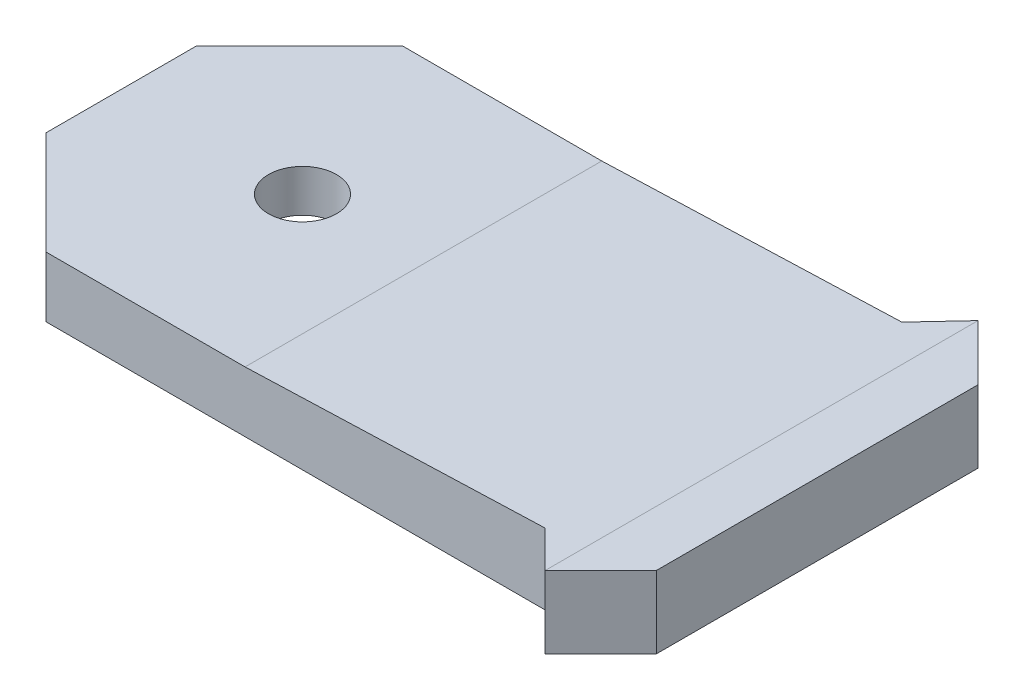
ISO-10303-21;
HEADER;
FILE_DESCRIPTION(('STEP AP214'),'2;1');
FILE_NAME('part.step','',(''),(''),'','','');
FILE_SCHEMA(('AUTOMOTIVE_DESIGN { 1 0 10303 214 1 1 1 1 }'));
ENDSEC;
DATA;
#1=APPLICATION_CONTEXT('core data for automotive mechanical design processes');
#2=APPLICATION_PROTOCOL_DEFINITION('international standard','automotive_design',2000,#1);
#3=PRODUCT_CONTEXT('',#1,'mechanical');
#4=PRODUCT('Part','Part','',(#3));
#5=PRODUCT_RELATED_PRODUCT_CATEGORY('part','',(#4));
#6=PRODUCT_DEFINITION_FORMATION('','',#4);
#7=PRODUCT_DEFINITION_CONTEXT('part definition',#1,'design');
#8=PRODUCT_DEFINITION('design','',#6,#7);
#9=PRODUCT_DEFINITION_SHAPE('','',#8);
#10=(LENGTH_UNIT() NAMED_UNIT(*) SI_UNIT(.MILLI.,.METRE.));
#11=(NAMED_UNIT(*) PLANE_ANGLE_UNIT() SI_UNIT($,.RADIAN.));
#12=(NAMED_UNIT(*) SI_UNIT($,.STERADIAN.) SOLID_ANGLE_UNIT());
#13=UNCERTAINTY_MEASURE_WITH_UNIT(LENGTH_MEASURE(1.E-05),#10,'distance_accuracy_value','');
#14=(GEOMETRIC_REPRESENTATION_CONTEXT(3) GLOBAL_UNCERTAINTY_ASSIGNED_CONTEXT((#13)) GLOBAL_UNIT_ASSIGNED_CONTEXT((#10,
#11,#12)) REPRESENTATION_CONTEXT('',''));
#15=CARTESIAN_POINT('',(0.,0.,0.));
#16=DIRECTION('',(0.,0.,1.));
#17=DIRECTION('',(1.,0.,0.));
#18=AXIS2_PLACEMENT_3D('',#15,#16,#17);
#19=CARTESIAN_POINT('',(12.,6.,0.));
#20=DIRECTION('',(0.,-1.,0.));
#21=DIRECTION('',(0.,0.,-1.));
#22=AXIS2_PLACEMENT_3D('',#19,#20,#21);
#23=CYLINDRICAL_SURFACE('',#22,2.25);
#24=CARTESIAN_POINT('',(12.,4.,0.));
#25=DIRECTION('',(0.,-1.,0.));
#26=DIRECTION('',(0.,0.,-1.));
#27=AXIS2_PLACEMENT_3D('',#24,#25,#26);
#28=CIRCLE('',#27,2.25);
#29=CARTESIAN_POINT('',(12.,4.,-2.25));
#30=VERTEX_POINT('',#29);
#31=EDGE_CURVE('E146',#30,#30,#28,.T.);
#32=ORIENTED_EDGE('',*,*,#31,.F.);
#33=EDGE_LOOP('',(#32));
#34=FACE_BOUND('',#33,.T.);
#35=CARTESIAN_POINT('',(12.,1.2,0.));
#36=DIRECTION('',(0.,-1.,0.));
#37=DIRECTION('',(0.,0.,-1.));
#38=AXIS2_PLACEMENT_3D('',#35,#36,#37);
#39=CIRCLE('',#38,2.25);
#40=CARTESIAN_POINT('',(12.,1.2,-2.25));
#41=VERTEX_POINT('',#40);
#42=EDGE_CURVE('E171',#41,#41,#39,.T.);
#43=ORIENTED_EDGE('',*,*,#42,.T.);
#44=EDGE_LOOP('',(#43));
#45=FACE_BOUND('',#44,.T.);
#46=ADVANCED_FACE('F37',(#34,#45),#23,.F.);
#47=CARTESIAN_POINT('',(0.,0.,0.));
#48=DIRECTION('',(0.,1.,0.));
#49=DIRECTION('',(0.,0.,1.));
#50=AXIS2_PLACEMENT_3D('',#47,#48,#49);
#51=PLANE('',#50);
#52=CARTESIAN_POINT('',(12.,0.,0.));
#53=DIRECTION('',(0.,-1.,0.));
#54=DIRECTION('',(0.,0.,-1.));
#55=AXIS2_PLACEMENT_3D('',#52,#53,#54);
#56=CIRCLE('',#55,10.);
#57=CARTESIAN_POINT('',(12.,0.,-10.));
#58=VERTEX_POINT('',#57);
#59=EDGE_CURVE('E192',#58,#58,#56,.T.);
#60=ORIENTED_EDGE('',*,*,#59,.F.);
#61=EDGE_LOOP('',(#60));
#62=FACE_BOUND('',#61,.T.);
#63=DIRECTION('',(-0.707106781186548,0.,0.707106781186547));
#64=VECTOR('',#63,1.);
#65=CARTESIAN_POINT('',(0.,0.,-4.97056274847714));
#66=LINE('',#65,#64);
#67=CARTESIAN_POINT('',(6.82943725152287,0.,-11.8));
#68=VERTEX_POINT('',#67);
#69=CARTESIAN_POINT('',(0.,0.,-4.97056274847714));
#70=VERTEX_POINT('',#69);
#71=EDGE_CURVE('E174',#68,#70,#66,.T.);
#72=ORIENTED_EDGE('',*,*,#71,.F.);
#73=DIRECTION('',(-1.,0.,0.));
#74=VECTOR('',#73,1.);
#75=CARTESIAN_POINT('',(6.82943725152287,0.,-11.8));
#76=LINE('',#75,#74);
#77=CARTESIAN_POINT('',(39.85294373,0.,-11.8));
#78=VERTEX_POINT('',#77);
#79=EDGE_CURVE('E221',#78,#68,#76,.T.);
#80=ORIENTED_EDGE('',*,*,#79,.F.);
#81=DIRECTION('',(-0.707106781186425,0.,0.70710678118667));
#82=VECTOR('',#81,1.);
#83=CARTESIAN_POINT('',(39.85294373,0.,-11.8));
#84=LINE('',#83,#82);
#85=CARTESIAN_POINT('',(42.3718560479508,0.,-14.3189123179507));
#86=VERTEX_POINT('',#85);
#87=EDGE_CURVE('E219',#86,#78,#84,.T.);
#88=ORIENTED_EDGE('',*,*,#87,.F.);
#89=DIRECTION('',(-0.707106781186547,0.,-0.707106781186548));
#90=VECTOR('',#89,1.);
#91=CARTESIAN_POINT('',(46.0488113101208,0.,-10.6419570557807));
#92=LINE('',#91,#90);
#93=CARTESIAN_POINT('',(46.0488113101208,0.,-10.6419570557807));
#94=VERTEX_POINT('',#93);
#95=EDGE_CURVE('E151',#94,#86,#92,.T.);
#96=ORIENTED_EDGE('',*,*,#95,.F.);
#97=DIRECTION('',(0.,0.,-1.));
#98=VECTOR('',#97,1.);
#99=CARTESIAN_POINT('',(46.0488113101208,0.,10.6419570557807));
#100=LINE('',#99,#98);
#101=CARTESIAN_POINT('',(46.0488113101208,0.,10.6419570557807));
#102=VERTEX_POINT('',#101);
#103=EDGE_CURVE('E215',#102,#94,#100,.T.);
#104=ORIENTED_EDGE('',*,*,#103,.F.);
#105=DIRECTION('',(0.707106781186549,0.,-0.707106781186546));
#106=VECTOR('',#105,1.);
#107=CARTESIAN_POINT('',(42.3718560479508,0.,14.3189123179508));
#108=LINE('',#107,#106);
#109=CARTESIAN_POINT('',(42.3718560479508,0.,14.3189123179508));
#110=VERTEX_POINT('',#109);
#111=EDGE_CURVE('E212',#110,#102,#108,.T.);
#112=ORIENTED_EDGE('',*,*,#111,.F.);
#113=DIRECTION('',(0.707106781186546,0.,0.707106781186549));
#114=VECTOR('',#113,1.);
#115=CARTESIAN_POINT('',(40.05294373,0.,12.));
#116=LINE('',#115,#114);
#117=CARTESIAN_POINT('',(39.85294373,0.,11.8));
#118=VERTEX_POINT('',#117);
#119=EDGE_CURVE('E209',#118,#110,#116,.T.);
#120=ORIENTED_EDGE('',*,*,#119,.F.);
#121=DIRECTION('',(1.,0.,0.));
#122=VECTOR('',#121,1.);
#123=CARTESIAN_POINT('',(6.82943725152288,0.,11.8));
#124=LINE('',#123,#122);
#125=CARTESIAN_POINT('',(6.82943725152288,0.,11.8));
#126=VERTEX_POINT('',#125);
#127=EDGE_CURVE('E207',#126,#118,#124,.T.);
#128=ORIENTED_EDGE('',*,*,#127,.F.);
#129=DIRECTION('',(0.707106781186549,0.,0.707106781186546));
#130=VECTOR('',#129,1.);
#131=CARTESIAN_POINT('',(0.,0.,4.97056274847714));
#132=LINE('',#131,#130);
#133=CARTESIAN_POINT('',(0.,0.,4.97056274847714));
#134=VERTEX_POINT('',#133);
#135=EDGE_CURVE('E204',#134,#126,#132,.T.);
#136=ORIENTED_EDGE('',*,*,#135,.F.);
#137=DIRECTION('',(0.,0.,1.));
#138=VECTOR('',#137,1.);
#139=CARTESIAN_POINT('',(0.,0.,-4.97056274847714));
#140=LINE('',#139,#138);
#141=EDGE_CURVE('E201',#70,#134,#140,.T.);
#142=ORIENTED_EDGE('',*,*,#141,.F.);
#143=EDGE_LOOP('',(#72,#80,#88,#96,#104,#112,#120,#128,#136,#142));
#144=FACE_BOUND('',#143,.T.);
#145=ADVANCED_FACE('F226',(#62,#144),#51,.F.);
#146=CARTESIAN_POINT('',(0.,6.,-4.97056274847714));
#147=DIRECTION('',(0.707106781186547,0.,0.707106781186548));
#148=DIRECTION('',(0.707106781186548,0.,-0.707106781186547));
#149=AXIS2_PLACEMENT_3D('',#146,#147,#148);
#150=PLANE('',#149);
#151=DIRECTION('',(0.,-1.,0.));
#152=VECTOR('',#151,1.);
#153=CARTESIAN_POINT('',(0.,6.,-4.97056274847714));
#154=LINE('',#153,#152);
#155=CARTESIAN_POINT('',(0.,4.,-4.97056274847714));
#156=VERTEX_POINT('',#155);
#157=EDGE_CURVE('E168',#156,#70,#154,.T.);
#158=ORIENTED_EDGE('',*,*,#157,.F.);
#159=DIRECTION('',(0.707106781186548,0.,-0.707106781186547));
#160=VECTOR('',#159,1.);
#161=CARTESIAN_POINT('',(0.,4.,-4.97056274847714));
#162=LINE('',#161,#160);
#163=CARTESIAN_POINT('',(6.82943725152287,4.,-11.8));
#164=VERTEX_POINT('',#163);
#165=EDGE_CURVE('E137',#156,#164,#162,.T.);
#166=ORIENTED_EDGE('',*,*,#165,.T.);
#167=DIRECTION('',(0.,-1.,0.));
#168=VECTOR('',#167,1.);
#169=CARTESIAN_POINT('',(6.82943725152287,6.,-11.8));
#170=LINE('',#169,#168);
#171=EDGE_CURVE('E60',#164,#68,#170,.T.);
#172=ORIENTED_EDGE('',*,*,#171,.T.);
#173=ORIENTED_EDGE('',*,*,#71,.T.);
#174=EDGE_LOOP('',(#158,#166,#172,#173));
#175=FACE_BOUND('',#174,.T.);
#176=ADVANCED_FACE('F39',(#175),#150,.F.);
#177=CARTESIAN_POINT('',(0.,6.,-4.97056274847714));
#178=DIRECTION('',(1.,0.,0.));
#179=DIRECTION('',(0.,0.,-1.));
#180=AXIS2_PLACEMENT_3D('',#177,#178,#179);
#181=PLANE('',#180);
#182=DIRECTION('',(0.,-1.,0.));
#183=VECTOR('',#182,1.);
#184=CARTESIAN_POINT('',(0.,6.,4.97056274847714));
#185=LINE('',#184,#183);
#186=CARTESIAN_POINT('',(0.,4.,4.97056274847715));
#187=VERTEX_POINT('',#186);
#188=EDGE_CURVE('E166',#187,#134,#185,.T.);
#189=ORIENTED_EDGE('',*,*,#188,.F.);
#190=DIRECTION('',(0.,0.,-1.));
#191=VECTOR('',#190,1.);
#192=CARTESIAN_POINT('',(0.,4.,14.3189123179508));
#193=LINE('',#192,#191);
#194=EDGE_CURVE('E181',#187,#156,#193,.T.);
#195=ORIENTED_EDGE('',*,*,#194,.T.);
#196=ORIENTED_EDGE('',*,*,#157,.T.);
#197=ORIENTED_EDGE('',*,*,#141,.T.);
#198=EDGE_LOOP('',(#189,#195,#196,#197));
#199=FACE_BOUND('',#198,.T.);
#200=ADVANCED_FACE('F232',(#199),#181,.F.);
#201=CARTESIAN_POINT('',(0.,6.,4.97056274847714));
#202=DIRECTION('',(0.707106781186546,0.,-0.707106781186549));
#203=DIRECTION('',(-0.707106781186549,0.,-0.707106781186546));
#204=AXIS2_PLACEMENT_3D('',#201,#202,#203);
#205=PLANE('',#204);
#206=DIRECTION('',(0.,-1.,0.));
#207=VECTOR('',#206,1.);
#208=CARTESIAN_POINT('',(6.82943725152288,6.,11.8));
#209=LINE('',#208,#207);
#210=CARTESIAN_POINT('',(6.82943725152288,4.,11.8));
#211=VERTEX_POINT('',#210);
#212=EDGE_CURVE('E164',#211,#126,#209,.T.);
#213=ORIENTED_EDGE('',*,*,#212,.F.);
#214=DIRECTION('',(-0.707106781186549,0.,-0.707106781186546));
#215=VECTOR('',#214,1.);
#216=CARTESIAN_POINT('',(0.,4.,4.97056274847714));
#217=LINE('',#216,#215);
#218=EDGE_CURVE('E239',#211,#187,#217,.T.);
#219=ORIENTED_EDGE('',*,*,#218,.T.);
#220=ORIENTED_EDGE('',*,*,#188,.T.);
#221=ORIENTED_EDGE('',*,*,#135,.T.);
#222=EDGE_LOOP('',(#213,#219,#220,#221));
#223=FACE_BOUND('',#222,.T.);
#224=ADVANCED_FACE('F289',(#223),#205,.F.);
#225=CARTESIAN_POINT('',(6.82943725152288,6.,11.8));
#226=DIRECTION('',(0.,0.,-1.));
#227=DIRECTION('',(-1.,0.,0.));
#228=AXIS2_PLACEMENT_3D('',#225,#226,#227);
#229=PLANE('',#228);
#230=DIRECTION('',(0.,-1.,0.));
#231=VECTOR('',#230,1.);
#232=CARTESIAN_POINT('',(39.85294373,6.,11.8));
#233=LINE('',#232,#231);
#234=CARTESIAN_POINT('',(39.85294373,4.69328007172783,11.8));
#235=VERTEX_POINT('',#234);
#236=EDGE_CURVE('E162',#235,#118,#233,.T.);
#237=ORIENTED_EDGE('',*,*,#236,.F.);
#238=DIRECTION('',(-0.999390827019096,-0.0348994967024938,0.));
#239=VECTOR('',#238,1.);
#240=CARTESIAN_POINT('',(6.91523513971955,3.54306994246052,11.8));
#241=LINE('',#240,#239);
#242=CARTESIAN_POINT('',(20.,4.,11.8));
#243=VERTEX_POINT('',#242);
#244=EDGE_CURVE('E180',#235,#243,#241,.T.);
#245=ORIENTED_EDGE('',*,*,#244,.T.);
#246=DIRECTION('',(-1.,0.,0.));
#247=VECTOR('',#246,1.);
#248=CARTESIAN_POINT('',(6.82943725152288,4.,11.8));
#249=LINE('',#248,#247);
#250=EDGE_CURVE('E187',#243,#211,#249,.T.);
#251=ORIENTED_EDGE('',*,*,#250,.T.);
#252=ORIENTED_EDGE('',*,*,#212,.T.);
#253=ORIENTED_EDGE('',*,*,#127,.T.);
#254=EDGE_LOOP('',(#237,#245,#251,#252,#253));
#255=FACE_BOUND('',#254,.T.);
#256=ADVANCED_FACE('F186',(#255),#229,.F.);
#257=CARTESIAN_POINT('',(40.05294373,6.,12.));
#258=DIRECTION('',(0.707106781186549,0.,-0.707106781186546));
#259=DIRECTION('',(-0.707106781186546,0.,-0.707106781186549));
#260=AXIS2_PLACEMENT_3D('',#257,#258,#259);
#261=PLANE('',#260);
#262=DIRECTION('',(0.,-1.,0.));
#263=VECTOR('',#262,1.);
#264=CARTESIAN_POINT('',(42.3718560479508,6.,14.3189123179508));
#265=LINE('',#264,#263);
#266=CARTESIAN_POINT('',(42.3718560479508,4.78124242815289,14.3189123179508));
#267=VERTEX_POINT('',#266);
#268=EDGE_CURVE('E160',#267,#110,#265,.T.);
#269=ORIENTED_EDGE('',*,*,#268,.F.);
#270=DIRECTION('',(-0.706891307583162,-0.0246851884078267,-0.706891307583166));
#271=VECTOR('',#270,1.);
#272=CARTESIAN_POINT('',(40.0756237879752,4.70105623070278,12.0226800579752));
#273=LINE('',#272,#271);
#274=EDGE_CURVE('E136',#267,#235,#273,.T.);
#275=ORIENTED_EDGE('',*,*,#274,.T.);
#276=ORIENTED_EDGE('',*,*,#236,.T.);
#277=ORIENTED_EDGE('',*,*,#119,.T.);
#278=EDGE_LOOP('',(#269,#275,#276,#277));
#279=FACE_BOUND('',#278,.T.);
#280=ADVANCED_FACE('F282',(#279),#261,.F.);
#281=CARTESIAN_POINT('',(42.3718560479508,6.,14.3189123179508));
#282=DIRECTION('',(-0.707106781186546,0.,-0.707106781186549));
#283=DIRECTION('',(-0.707106781186549,0.,0.707106781186546));
#284=AXIS2_PLACEMENT_3D('',#281,#282,#283);
#285=PLANE('',#284);
#286=DIRECTION('',(0.,-1.,0.));
#287=VECTOR('',#286,1.);
#288=CARTESIAN_POINT('',(46.0488113101208,6.,10.6419570557807));
#289=LINE('',#288,#287);
#290=CARTESIAN_POINT('',(46.0488113101208,4.78124242815289,10.6419570557807));
#291=VERTEX_POINT('',#290);
#292=EDGE_CURVE('E154',#291,#102,#289,.T.);
#293=ORIENTED_EDGE('',*,*,#292,.F.);
#294=DIRECTION('',(-0.707106781186549,0.,0.707106781186546));
#295=VECTOR('',#294,1.);
#296=CARTESIAN_POINT('',(42.3718560479508,4.78124242815289,14.3189123179508));
#297=LINE('',#296,#295);
#298=EDGE_CURVE('E190',#291,#267,#297,.T.);
#299=ORIENTED_EDGE('',*,*,#298,.T.);
#300=ORIENTED_EDGE('',*,*,#268,.T.);
#301=ORIENTED_EDGE('',*,*,#111,.T.);
#302=EDGE_LOOP('',(#293,#299,#300,#301));
#303=FACE_BOUND('',#302,.T.);
#304=ADVANCED_FACE('F278',(#303),#285,.F.);
#305=CARTESIAN_POINT('',(46.0488113101208,6.,10.6419570557807));
#306=DIRECTION('',(-1.,0.,0.));
#307=DIRECTION('',(0.,0.,1.));
#308=AXIS2_PLACEMENT_3D('',#305,#306,#307);
#309=PLANE('',#308);
#310=DIRECTION('',(0.,-1.,0.));
#311=VECTOR('',#310,1.);
#312=CARTESIAN_POINT('',(46.0488113101208,6.,-10.6419570557807));
#313=LINE('',#312,#311);
#314=CARTESIAN_POINT('',(46.0488113101208,4.78124242815289,-10.6419570557807));
#315=VERTEX_POINT('',#314);
#316=EDGE_CURVE('E152',#315,#94,#313,.T.);
#317=ORIENTED_EDGE('',*,*,#316,.F.);
#318=DIRECTION('',(0.,0.,-1.));
#319=VECTOR('',#318,1.);
#320=CARTESIAN_POINT('',(46.0488113101208,4.78124242815289,14.3189123179508));
#321=LINE('',#320,#319);
#322=EDGE_CURVE('E126',#291,#315,#321,.T.);
#323=ORIENTED_EDGE('',*,*,#322,.F.);
#324=ORIENTED_EDGE('',*,*,#292,.T.);
#325=ORIENTED_EDGE('',*,*,#103,.T.);
#326=EDGE_LOOP('',(#317,#323,#324,#325));
#327=FACE_BOUND('',#326,.T.);
#328=ADVANCED_FACE('F275',(#327),#309,.F.);
#329=CARTESIAN_POINT('',(46.0488113101208,6.,-10.6419570557807));
#330=DIRECTION('',(-0.707106781186548,0.,0.707106781186547));
#331=DIRECTION('',(0.707106781186547,0.,0.707106781186548));
#332=AXIS2_PLACEMENT_3D('',#329,#330,#331);
#333=PLANE('',#332);
#334=DIRECTION('',(0.,-1.,0.));
#335=VECTOR('',#334,1.);
#336=CARTESIAN_POINT('',(42.3718560479508,6.,-14.3189123179507));
#337=LINE('',#336,#335);
#338=CARTESIAN_POINT('',(42.3718560479508,4.78124242815289,-14.3189123179507));
#339=VERTEX_POINT('',#338);
#340=EDGE_CURVE('E143',#339,#86,#337,.T.);
#341=ORIENTED_EDGE('',*,*,#340,.F.);
#342=DIRECTION('',(0.707106781186547,0.,0.707106781186548));
#343=VECTOR('',#342,1.);
#344=CARTESIAN_POINT('',(46.0488113101208,4.78124242815289,-10.6419570557807));
#345=LINE('',#344,#343);
#346=EDGE_CURVE('E11',#339,#315,#345,.T.);
#347=ORIENTED_EDGE('',*,*,#346,.T.);
#348=ORIENTED_EDGE('',*,*,#316,.T.);
#349=ORIENTED_EDGE('',*,*,#95,.T.);
#350=EDGE_LOOP('',(#341,#347,#348,#349));
#351=FACE_BOUND('',#350,.T.);
#352=ADVANCED_FACE('F149',(#351),#333,.F.);
#353=CARTESIAN_POINT('',(39.85294373,6.,-11.8));
#354=DIRECTION('',(0.70710678118667,0.,0.707106781186425));
#355=DIRECTION('',(0.707106781186425,0.,-0.70710678118667));
#356=AXIS2_PLACEMENT_3D('',#353,#354,#355);
#357=PLANE('',#356);
#358=DIRECTION('',(0.,-1.,0.));
#359=VECTOR('',#358,1.);
#360=CARTESIAN_POINT('',(39.85294373,6.,-11.8));
#361=LINE('',#360,#359);
#362=CARTESIAN_POINT('',(39.85294373,4.69328007172783,-11.8));
#363=VERTEX_POINT('',#362);
#364=EDGE_CURVE('E145',#363,#78,#361,.T.);
#365=ORIENTED_EDGE('',*,*,#364,.F.);
#366=DIRECTION('',(0.706891307583041,0.0246851884078225,-0.706891307583286));
#367=VECTOR('',#366,1.);
#368=CARTESIAN_POINT('',(39.8757456596805,4.69407633265817,-11.8228019296805));
#369=LINE('',#368,#367);
#370=EDGE_CURVE('E133',#363,#339,#369,.T.);
#371=ORIENTED_EDGE('',*,*,#370,.T.);
#372=ORIENTED_EDGE('',*,*,#340,.T.);
#373=ORIENTED_EDGE('',*,*,#87,.T.);
#374=EDGE_LOOP('',(#365,#371,#372,#373));
#375=FACE_BOUND('',#374,.T.);
#376=ADVANCED_FACE('F141',(#375),#357,.F.);
#377=CARTESIAN_POINT('',(6.82943725152287,6.,-11.8));
#378=DIRECTION('',(0.,0.,1.));
#379=DIRECTION('',(1.,0.,0.));
#380=AXIS2_PLACEMENT_3D('',#377,#378,#379);
#381=PLANE('',#380);
#382=DIRECTION('',(1.,0.,0.));
#383=VECTOR('',#382,1.);
#384=CARTESIAN_POINT('',(6.82943725152287,4.,-11.8));
#385=LINE('',#384,#383);
#386=CARTESIAN_POINT('',(20.,4.,-11.8));
#387=VERTEX_POINT('',#386);
#388=EDGE_CURVE('E170',#164,#387,#385,.T.);
#389=ORIENTED_EDGE('',*,*,#388,.T.);
#390=DIRECTION('',(0.999390827019096,0.0348994967024938,0.));
#391=VECTOR('',#390,1.);
#392=CARTESIAN_POINT('',(6.91523513971953,3.54306994246052,-11.8));
#393=LINE('',#392,#391);
#394=EDGE_CURVE('E45',#387,#363,#393,.T.);
#395=ORIENTED_EDGE('',*,*,#394,.T.);
#396=ORIENTED_EDGE('',*,*,#364,.T.);
#397=ORIENTED_EDGE('',*,*,#79,.T.);
#398=ORIENTED_EDGE('',*,*,#171,.F.);
#399=EDGE_LOOP('',(#389,#395,#396,#397,#398));
#400=FACE_BOUND('',#399,.T.);
#401=ADVANCED_FACE('F178',(#400),#381,.F.);
#402=CARTESIAN_POINT('',(12.,1.2,0.));
#403=DIRECTION('',(0.,-1.,0.));
#404=DIRECTION('',(0.,0.,-1.));
#405=AXIS2_PLACEMENT_3D('',#402,#403,#404);
#406=CYLINDRICAL_SURFACE('',#405,10.);
#407=CARTESIAN_POINT('',(12.,1.2,0.));
#408=DIRECTION('',(0.,-1.,0.));
#409=DIRECTION('',(0.,0.,-1.));
#410=AXIS2_PLACEMENT_3D('',#407,#408,#409);
#411=CIRCLE('',#410,10.);
#412=CARTESIAN_POINT('',(12.,1.2,-10.));
#413=VERTEX_POINT('',#412);
#414=EDGE_CURVE('E175',#413,#413,#411,.T.);
#415=ORIENTED_EDGE('',*,*,#414,.F.);
#416=EDGE_LOOP('',(#415));
#417=FACE_BOUND('',#416,.T.);
#418=ORIENTED_EDGE('',*,*,#59,.T.);
#419=EDGE_LOOP('',(#418));
#420=FACE_BOUND('',#419,.T.);
#421=ADVANCED_FACE('F254',(#417,#420),#406,.F.);
#422=CARTESIAN_POINT('',(12.,1.2,0.));
#423=DIRECTION('',(0.,-1.,0.));
#424=DIRECTION('',(0.,0.,-1.));
#425=AXIS2_PLACEMENT_3D('',#422,#423,#424);
#426=PLANE('',#425);
#427=ORIENTED_EDGE('',*,*,#42,.F.);
#428=EDGE_LOOP('',(#427));
#429=FACE_BOUND('',#428,.T.);
#430=ORIENTED_EDGE('',*,*,#414,.T.);
#431=EDGE_LOOP('',(#430));
#432=FACE_BOUND('',#431,.T.);
#433=ADVANCED_FACE('F251',(#429,#432),#426,.T.);
#434=CARTESIAN_POINT('',(42.3718560479508,4.78124242815289,14.3189123179508));
#435=DIRECTION('',(0.,-1.,0.));
#436=DIRECTION('',(0.,0.,-1.));
#437=AXIS2_PLACEMENT_3D('',#434,#435,#436);
#438=PLANE('',#437);
#439=ORIENTED_EDGE('',*,*,#322,.T.);
#440=ORIENTED_EDGE('',*,*,#346,.F.);
#441=DIRECTION('',(0.,0.,-1.));
#442=VECTOR('',#441,1.);
#443=CARTESIAN_POINT('',(42.3718560479508,4.78124242815289,14.3189123179508));
#444=LINE('',#443,#442);
#445=EDGE_CURVE('E123',#267,#339,#444,.T.);
#446=ORIENTED_EDGE('',*,*,#445,.F.);
#447=ORIENTED_EDGE('',*,*,#298,.F.);
#448=EDGE_LOOP('',(#439,#440,#446,#447));
#449=FACE_BOUND('',#448,.T.);
#450=ADVANCED_FACE('F122',(#449),#438,.F.);
#451=CARTESIAN_POINT('',(20.,4.,14.3189123179508));
#452=DIRECTION('',(0.0348994967024938,-0.999390827019096,0.));
#453=DIRECTION('',(0.999390827019096,0.0348994967024938,0.));
#454=AXIS2_PLACEMENT_3D('',#451,#452,#453);
#455=PLANE('',#454);
#456=ORIENTED_EDGE('',*,*,#274,.F.);
#457=ORIENTED_EDGE('',*,*,#445,.T.);
#458=ORIENTED_EDGE('',*,*,#370,.F.);
#459=ORIENTED_EDGE('',*,*,#394,.F.);
#460=DIRECTION('',(0.,0.,-1.));
#461=VECTOR('',#460,1.);
#462=CARTESIAN_POINT('',(20.,4.,14.3189123179508));
#463=LINE('',#462,#461);
#464=EDGE_CURVE('E52',#243,#387,#463,.T.);
#465=ORIENTED_EDGE('',*,*,#464,.F.);
#466=ORIENTED_EDGE('',*,*,#244,.F.);
#467=EDGE_LOOP('',(#456,#457,#458,#459,#465,#466));
#468=FACE_BOUND('',#467,.T.);
#469=ADVANCED_FACE('F132',(#468),#455,.F.);
#470=CARTESIAN_POINT('',(20.,4.,14.3189123179508));
#471=DIRECTION('',(0.,-1.,0.));
#472=DIRECTION('',(0.,0.,-1.));
#473=AXIS2_PLACEMENT_3D('',#470,#471,#472);
#474=PLANE('',#473);
#475=ORIENTED_EDGE('',*,*,#31,.T.);
#476=EDGE_LOOP('',(#475));
#477=FACE_BOUND('',#476,.T.);
#478=ORIENTED_EDGE('',*,*,#250,.F.);
#479=ORIENTED_EDGE('',*,*,#464,.T.);
#480=ORIENTED_EDGE('',*,*,#388,.F.);
#481=ORIENTED_EDGE('',*,*,#165,.F.);
#482=ORIENTED_EDGE('',*,*,#194,.F.);
#483=ORIENTED_EDGE('',*,*,#218,.F.);
#484=EDGE_LOOP('',(#478,#479,#480,#481,#482,#483));
#485=FACE_BOUND('',#484,.T.);
#486=ADVANCED_FACE('F244',(#477,#485),#474,.F.);
#487=CLOSED_SHELL('',(#46,#145,#176,#200,#224,#256,#280,#304,#328,#352,#376,#401,#421,#433,#450,
#469,#486));
#488=MANIFOLD_SOLID_BREP('B2',#487);
#489=ADVANCED_BREP_SHAPE_REPRESENTATION('',(#18,#488),#14);
#490=SHAPE_DEFINITION_REPRESENTATION(#9,#489);
ENDSEC;
END-ISO-10303-21;
